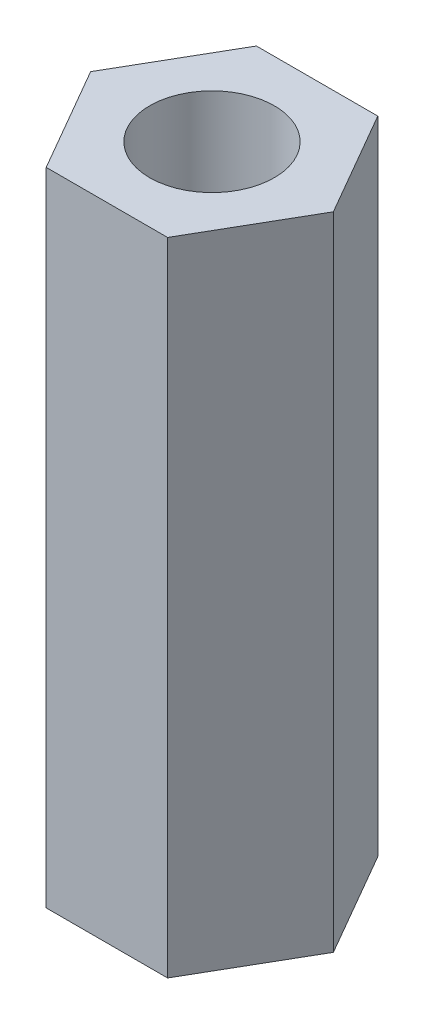
ISO-10303-21;
HEADER;
FILE_DESCRIPTION(('STEP AP214'),'2;1');
FILE_NAME('part.step','',(''),(''),'','','');
FILE_SCHEMA(('AUTOMOTIVE_DESIGN { 1 0 10303 214 1 1 1 1 }'));
ENDSEC;
DATA;
#1=APPLICATION_CONTEXT('core data for automotive mechanical design processes');
#2=APPLICATION_PROTOCOL_DEFINITION('international standard','automotive_design',2000,#1);
#3=PRODUCT_CONTEXT('',#1,'mechanical');
#4=PRODUCT('Part','Part','',(#3));
#5=PRODUCT_RELATED_PRODUCT_CATEGORY('part','',(#4));
#6=PRODUCT_DEFINITION_FORMATION('','',#4);
#7=PRODUCT_DEFINITION_CONTEXT('part definition',#1,'design');
#8=PRODUCT_DEFINITION('design','',#6,#7);
#9=PRODUCT_DEFINITION_SHAPE('','',#8);
#10=(LENGTH_UNIT() NAMED_UNIT(*) SI_UNIT(.MILLI.,.METRE.));
#11=(NAMED_UNIT(*) PLANE_ANGLE_UNIT() SI_UNIT($,.RADIAN.));
#12=(NAMED_UNIT(*) SI_UNIT($,.STERADIAN.) SOLID_ANGLE_UNIT());
#13=UNCERTAINTY_MEASURE_WITH_UNIT(LENGTH_MEASURE(1.E-05),#10,'distance_accuracy_value','');
#14=(GEOMETRIC_REPRESENTATION_CONTEXT(3) GLOBAL_UNCERTAINTY_ASSIGNED_CONTEXT((#13)) GLOBAL_UNIT_ASSIGNED_CONTEXT((#10,
#11,#12)) REPRESENTATION_CONTEXT('',''));
#15=CARTESIAN_POINT('',(0.,0.,0.));
#16=DIRECTION('',(0.,0.,1.));
#17=DIRECTION('',(1.,0.,0.));
#18=AXIS2_PLACEMENT_3D('',#15,#16,#17);
#19=CARTESIAN_POINT('',(0.,9.,0.));
#20=DIRECTION('',(0.,1.,0.));
#21=DIRECTION('',(0.,0.,1.));
#22=AXIS2_PLACEMENT_3D('',#19,#20,#21);
#23=PLANE('',#22);
#24=DIRECTION('',(0.5,0.,-0.866025403784439));
#25=VECTOR('',#24,1.);
#26=CARTESIAN_POINT('',(1.7031832941094,9.,2.95));
#27=LINE('',#26,#25);
#28=CARTESIAN_POINT('',(1.7031832941094,9.,2.95));
#29=VERTEX_POINT('',#28);
#30=CARTESIAN_POINT('',(3.40636658821879,9.,0.));
#31=VERTEX_POINT('',#30);
#32=EDGE_CURVE('E143',#29,#31,#27,.T.);
#33=ORIENTED_EDGE('',*,*,#32,.T.);
#34=DIRECTION('',(-0.5,0.,-0.866025403784439));
#35=VECTOR('',#34,1.);
#36=CARTESIAN_POINT('',(3.40636658821879,9.,0.));
#37=LINE('',#36,#35);
#38=CARTESIAN_POINT('',(1.7031832941094,9.,-2.95));
#39=VERTEX_POINT('',#38);
#40=EDGE_CURVE('E101',#31,#39,#37,.T.);
#41=ORIENTED_EDGE('',*,*,#40,.T.);
#42=DIRECTION('',(-1.,0.,0.));
#43=VECTOR('',#42,1.);
#44=CARTESIAN_POINT('',(1.7031832941094,9.,-2.95));
#45=LINE('',#44,#43);
#46=CARTESIAN_POINT('',(-1.7031832941094,9.,-2.95));
#47=VERTEX_POINT('',#46);
#48=EDGE_CURVE('E114',#39,#47,#45,.T.);
#49=ORIENTED_EDGE('',*,*,#48,.T.);
#50=DIRECTION('',(-0.5,0.,0.866025403784439));
#51=VECTOR('',#50,1.);
#52=CARTESIAN_POINT('',(-1.7031832941094,9.,-2.95));
#53=LINE('',#52,#51);
#54=CARTESIAN_POINT('',(-3.40636658821879,9.,0.));
#55=VERTEX_POINT('',#54);
#56=EDGE_CURVE('E108',#47,#55,#53,.T.);
#57=ORIENTED_EDGE('',*,*,#56,.T.);
#58=DIRECTION('',(0.5,0.,0.866025403784439));
#59=VECTOR('',#58,1.);
#60=CARTESIAN_POINT('',(-3.40636658821879,9.,0.));
#61=LINE('',#60,#59);
#62=CARTESIAN_POINT('',(-1.7031832941094,9.,2.95));
#63=VERTEX_POINT('',#62);
#64=EDGE_CURVE('E112',#55,#63,#61,.T.);
#65=ORIENTED_EDGE('',*,*,#64,.T.);
#66=DIRECTION('',(1.,0.,0.));
#67=VECTOR('',#66,1.);
#68=CARTESIAN_POINT('',(-1.7031832941094,9.,2.95));
#69=LINE('',#68,#67);
#70=EDGE_CURVE('E64',#63,#29,#69,.T.);
#71=ORIENTED_EDGE('',*,*,#70,.T.);
#72=EDGE_LOOP('',(#33,#41,#49,#57,#65,#71));
#73=FACE_BOUND('',#72,.T.);
#74=CARTESIAN_POINT('',(0.,9.,0.));
#75=DIRECTION('',(0.,1.,0.));
#76=DIRECTION('',(0.,0.,1.));
#77=AXIS2_PLACEMENT_3D('',#74,#75,#76);
#78=CIRCLE('',#77,1.75);
#79=CARTESIAN_POINT('',(0.,9.,1.75));
#80=VERTEX_POINT('',#79);
#81=EDGE_CURVE('E136',#80,#80,#78,.T.);
#82=ORIENTED_EDGE('',*,*,#81,.F.);
#83=EDGE_LOOP('',(#82));
#84=FACE_BOUND('',#83,.T.);
#85=ADVANCED_FACE('F47',(#73,#84),#23,.T.);
#86=CARTESIAN_POINT('',(0.,-9.,0.));
#87=DIRECTION('',(0.,1.,0.));
#88=DIRECTION('',(0.,0.,1.));
#89=AXIS2_PLACEMENT_3D('',#86,#87,#88);
#90=PLANE('',#89);
#91=DIRECTION('',(0.5,0.,-0.866025403784439));
#92=VECTOR('',#91,1.);
#93=CARTESIAN_POINT('',(1.7031832941094,-9.,2.95));
#94=LINE('',#93,#92);
#95=CARTESIAN_POINT('',(1.7031832941094,-9.,2.95));
#96=VERTEX_POINT('',#95);
#97=CARTESIAN_POINT('',(3.40636658821879,-9.,0.));
#98=VERTEX_POINT('',#97);
#99=EDGE_CURVE('E132',#96,#98,#94,.T.);
#100=ORIENTED_EDGE('',*,*,#99,.F.);
#101=DIRECTION('',(1.,0.,0.));
#102=VECTOR('',#101,1.);
#103=CARTESIAN_POINT('',(-1.7031832941094,-9.,2.95));
#104=LINE('',#103,#102);
#105=CARTESIAN_POINT('',(-1.7031832941094,-9.,2.95));
#106=VERTEX_POINT('',#105);
#107=EDGE_CURVE('E93',#106,#96,#104,.T.);
#108=ORIENTED_EDGE('',*,*,#107,.F.);
#109=DIRECTION('',(0.5,0.,0.866025403784439));
#110=VECTOR('',#109,1.);
#111=CARTESIAN_POINT('',(-3.40636658821879,-9.,0.));
#112=LINE('',#111,#110);
#113=CARTESIAN_POINT('',(-3.40636658821879,-9.,0.));
#114=VERTEX_POINT('',#113);
#115=EDGE_CURVE('E87',#114,#106,#112,.T.);
#116=ORIENTED_EDGE('',*,*,#115,.F.);
#117=DIRECTION('',(-0.5,0.,0.866025403784439));
#118=VECTOR('',#117,1.);
#119=CARTESIAN_POINT('',(-1.7031832941094,-9.,-2.95));
#120=LINE('',#119,#118);
#121=CARTESIAN_POINT('',(-1.7031832941094,-9.,-2.95));
#122=VERTEX_POINT('',#121);
#123=EDGE_CURVE('E122',#122,#114,#120,.T.);
#124=ORIENTED_EDGE('',*,*,#123,.F.);
#125=DIRECTION('',(-1.,0.,0.));
#126=VECTOR('',#125,1.);
#127=CARTESIAN_POINT('',(1.7031832941094,-9.,-2.95));
#128=LINE('',#127,#126);
#129=CARTESIAN_POINT('',(1.7031832941094,-9.,-2.95));
#130=VERTEX_POINT('',#129);
#131=EDGE_CURVE('E138',#130,#122,#128,.T.);
#132=ORIENTED_EDGE('',*,*,#131,.F.);
#133=DIRECTION('',(-0.5,0.,-0.866025403784439));
#134=VECTOR('',#133,1.);
#135=CARTESIAN_POINT('',(3.40636658821879,-9.,0.));
#136=LINE('',#135,#134);
#137=EDGE_CURVE('E135',#98,#130,#136,.T.);
#138=ORIENTED_EDGE('',*,*,#137,.F.);
#139=EDGE_LOOP('',(#100,#108,#116,#124,#132,#138));
#140=FACE_BOUND('',#139,.T.);
#141=CARTESIAN_POINT('',(0.,-9.,0.));
#142=DIRECTION('',(0.,1.,0.));
#143=DIRECTION('',(0.,0.,1.));
#144=AXIS2_PLACEMENT_3D('',#141,#142,#143);
#145=CIRCLE('',#144,1.75);
#146=CARTESIAN_POINT('',(0.,-9.,1.75));
#147=VERTEX_POINT('',#146);
#148=EDGE_CURVE('E272',#147,#147,#145,.T.);
#149=ORIENTED_EDGE('',*,*,#148,.T.);
#150=EDGE_LOOP('',(#149));
#151=FACE_BOUND('',#150,.T.);
#152=ADVANCED_FACE('F152',(#140,#151),#90,.F.);
#153=CARTESIAN_POINT('',(1.7031832941094,9.,2.95));
#154=DIRECTION('',(-0.866025403784439,0.,-0.5));
#155=DIRECTION('',(-0.5,0.,0.866025403784439));
#156=AXIS2_PLACEMENT_3D('',#153,#154,#155);
#157=PLANE('',#156);
#158=ORIENTED_EDGE('',*,*,#99,.T.);
#159=DIRECTION('',(0.,-1.,0.));
#160=VECTOR('',#159,1.);
#161=CARTESIAN_POINT('',(3.40636658821879,9.,0.));
#162=LINE('',#161,#160);
#163=EDGE_CURVE('E11',#31,#98,#162,.T.);
#164=ORIENTED_EDGE('',*,*,#163,.F.);
#165=ORIENTED_EDGE('',*,*,#32,.F.);
#166=DIRECTION('',(0.,-1.,0.));
#167=VECTOR('',#166,1.);
#168=CARTESIAN_POINT('',(1.7031832941094,9.,2.95));
#169=LINE('',#168,#167);
#170=EDGE_CURVE('E128',#29,#96,#169,.T.);
#171=ORIENTED_EDGE('',*,*,#170,.T.);
#172=EDGE_LOOP('',(#158,#164,#165,#171));
#173=FACE_BOUND('',#172,.T.);
#174=ADVANCED_FACE('F49',(#173),#157,.F.);
#175=CARTESIAN_POINT('',(3.40636658821879,9.,0.));
#176=DIRECTION('',(-0.866025403784439,0.,0.5));
#177=DIRECTION('',(0.5,0.,0.866025403784439));
#178=AXIS2_PLACEMENT_3D('',#175,#176,#177);
#179=PLANE('',#178);
#180=ORIENTED_EDGE('',*,*,#137,.T.);
#181=DIRECTION('',(0.,-1.,0.));
#182=VECTOR('',#181,1.);
#183=CARTESIAN_POINT('',(1.7031832941094,9.,-2.95));
#184=LINE('',#183,#182);
#185=EDGE_CURVE('E56',#39,#130,#184,.T.);
#186=ORIENTED_EDGE('',*,*,#185,.F.);
#187=ORIENTED_EDGE('',*,*,#40,.F.);
#188=ORIENTED_EDGE('',*,*,#163,.T.);
#189=EDGE_LOOP('',(#180,#186,#187,#188));
#190=FACE_BOUND('',#189,.T.);
#191=ADVANCED_FACE('F177',(#190),#179,.F.);
#192=CARTESIAN_POINT('',(1.7031832941094,9.,-2.95));
#193=DIRECTION('',(0.,0.,1.));
#194=DIRECTION('',(1.,0.,0.));
#195=AXIS2_PLACEMENT_3D('',#192,#193,#194);
#196=PLANE('',#195);
#197=ORIENTED_EDGE('',*,*,#131,.T.);
#198=DIRECTION('',(0.,-1.,0.));
#199=VECTOR('',#198,1.);
#200=CARTESIAN_POINT('',(-1.7031832941094,9.,-2.95));
#201=LINE('',#200,#199);
#202=EDGE_CURVE('E123',#47,#122,#201,.T.);
#203=ORIENTED_EDGE('',*,*,#202,.F.);
#204=ORIENTED_EDGE('',*,*,#48,.F.);
#205=ORIENTED_EDGE('',*,*,#185,.T.);
#206=EDGE_LOOP('',(#197,#203,#204,#205));
#207=FACE_BOUND('',#206,.T.);
#208=ADVANCED_FACE('F149',(#207),#196,.F.);
#209=CARTESIAN_POINT('',(-1.7031832941094,9.,-2.95));
#210=DIRECTION('',(0.866025403784439,0.,0.5));
#211=DIRECTION('',(0.5,0.,-0.866025403784439));
#212=AXIS2_PLACEMENT_3D('',#209,#210,#211);
#213=PLANE('',#212);
#214=ORIENTED_EDGE('',*,*,#123,.T.);
#215=DIRECTION('',(0.,-1.,0.));
#216=VECTOR('',#215,1.);
#217=CARTESIAN_POINT('',(-3.40636658821879,9.,0.));
#218=LINE('',#217,#216);
#219=EDGE_CURVE('E119',#55,#114,#218,.T.);
#220=ORIENTED_EDGE('',*,*,#219,.F.);
#221=ORIENTED_EDGE('',*,*,#56,.F.);
#222=ORIENTED_EDGE('',*,*,#202,.T.);
#223=EDGE_LOOP('',(#214,#220,#221,#222));
#224=FACE_BOUND('',#223,.T.);
#225=ADVANCED_FACE('F120',(#224),#213,.F.);
#226=CARTESIAN_POINT('',(-3.40636658821879,9.,0.));
#227=DIRECTION('',(0.866025403784439,0.,-0.5));
#228=DIRECTION('',(-0.5,0.,-0.866025403784439));
#229=AXIS2_PLACEMENT_3D('',#226,#227,#228);
#230=PLANE('',#229);
#231=ORIENTED_EDGE('',*,*,#115,.T.);
#232=DIRECTION('',(0.,-1.,0.));
#233=VECTOR('',#232,1.);
#234=CARTESIAN_POINT('',(-1.7031832941094,9.,2.95));
#235=LINE('',#234,#233);
#236=EDGE_CURVE('E124',#63,#106,#235,.T.);
#237=ORIENTED_EDGE('',*,*,#236,.F.);
#238=ORIENTED_EDGE('',*,*,#64,.F.);
#239=ORIENTED_EDGE('',*,*,#219,.T.);
#240=EDGE_LOOP('',(#231,#237,#238,#239));
#241=FACE_BOUND('',#240,.T.);
#242=ADVANCED_FACE('F126',(#241),#230,.F.);
#243=CARTESIAN_POINT('',(-1.7031832941094,9.,2.95));
#244=DIRECTION('',(0.,0.,-1.));
#245=DIRECTION('',(-1.,0.,0.));
#246=AXIS2_PLACEMENT_3D('',#243,#244,#245);
#247=PLANE('',#246);
#248=ORIENTED_EDGE('',*,*,#107,.T.);
#249=ORIENTED_EDGE('',*,*,#170,.F.);
#250=ORIENTED_EDGE('',*,*,#70,.F.);
#251=ORIENTED_EDGE('',*,*,#236,.T.);
#252=EDGE_LOOP('',(#248,#249,#250,#251));
#253=FACE_BOUND('',#252,.T.);
#254=ADVANCED_FACE('F157',(#253),#247,.F.);
#255=CARTESIAN_POINT('',(0.,9.,0.));
#256=DIRECTION('',(0.,-1.,0.));
#257=DIRECTION('',(0.,0.,-1.));
#258=AXIS2_PLACEMENT_3D('',#255,#256,#257);
#259=CYLINDRICAL_SURFACE('',#258,1.75);
#260=ORIENTED_EDGE('',*,*,#81,.T.);
#261=EDGE_LOOP('',(#260));
#262=FACE_BOUND('',#261,.T.);
#263=ORIENTED_EDGE('',*,*,#148,.F.);
#264=EDGE_LOOP('',(#263));
#265=FACE_BOUND('',#264,.T.);
#266=ADVANCED_FACE('F159',(#262,#265),#259,.F.);
#267=CLOSED_SHELL('',(#85,#152,#174,#191,#208,#225,#242,#254,#266));
#268=MANIFOLD_SOLID_BREP('B2',#267);
#269=ADVANCED_BREP_SHAPE_REPRESENTATION('',(#18,#268),#14);
#270=SHAPE_DEFINITION_REPRESENTATION(#9,#269);
ENDSEC;
END-ISO-10303-21;
